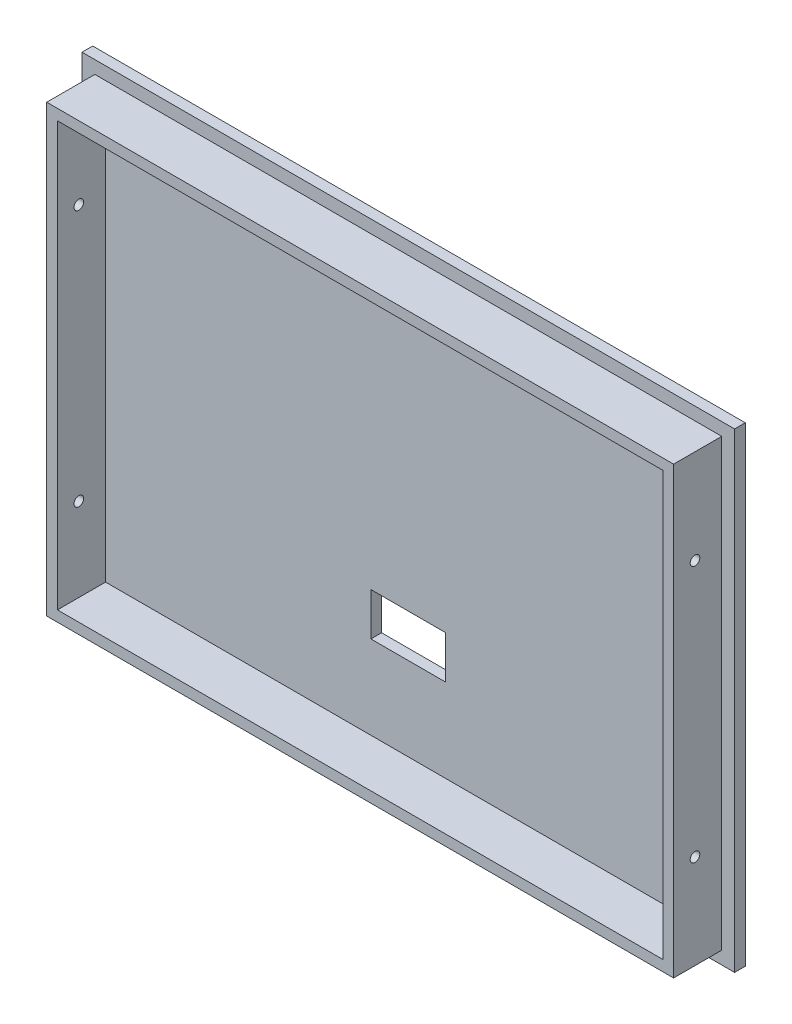
ISO-10303-21;
HEADER;
FILE_DESCRIPTION(('STEP AP214'),'2;1');
FILE_NAME('part.step','',(''),(''),'','','');
FILE_SCHEMA(('AUTOMOTIVE_DESIGN { 1 0 10303 214 1 1 1 1 }'));
ENDSEC;
DATA;
#1=APPLICATION_CONTEXT('core data for automotive mechanical design processes');
#2=APPLICATION_PROTOCOL_DEFINITION('international standard','automotive_design',2000,#1);
#3=PRODUCT_CONTEXT('',#1,'mechanical');
#4=PRODUCT('Part','Part','',(#3));
#5=PRODUCT_RELATED_PRODUCT_CATEGORY('part','',(#4));
#6=PRODUCT_DEFINITION_FORMATION('','',#4);
#7=PRODUCT_DEFINITION_CONTEXT('part definition',#1,'design');
#8=PRODUCT_DEFINITION('design','',#6,#7);
#9=PRODUCT_DEFINITION_SHAPE('','',#8);
#10=(LENGTH_UNIT() NAMED_UNIT(*) SI_UNIT(.MILLI.,.METRE.));
#11=(NAMED_UNIT(*) PLANE_ANGLE_UNIT() SI_UNIT($,.RADIAN.));
#12=(NAMED_UNIT(*) SI_UNIT($,.STERADIAN.) SOLID_ANGLE_UNIT());
#13=UNCERTAINTY_MEASURE_WITH_UNIT(LENGTH_MEASURE(1.E-05),#10,'distance_accuracy_value','');
#14=(GEOMETRIC_REPRESENTATION_CONTEXT(3) GLOBAL_UNCERTAINTY_ASSIGNED_CONTEXT((#13)) GLOBAL_UNIT_ASSIGNED_CONTEXT((#10,
#11,#12)) REPRESENTATION_CONTEXT('',''));
#15=CARTESIAN_POINT('',(0.,0.,0.));
#16=DIRECTION('',(0.,0.,1.));
#17=DIRECTION('',(1.,0.,0.));
#18=AXIS2_PLACEMENT_3D('',#15,#16,#17);
#19=CARTESIAN_POINT('',(0.,0.,-2.));
#20=DIRECTION('',(0.,0.,-1.));
#21=DIRECTION('',(-1.,0.,0.));
#22=AXIS2_PLACEMENT_3D('',#19,#20,#21);
#23=PLANE('',#22);
#24=DIRECTION('',(0.,-1.,0.));
#25=VECTOR('',#24,1.);
#26=CARTESIAN_POINT('',(-61.,0.,-2.));
#27=LINE('',#26,#25);
#28=CARTESIAN_POINT('',(-61.,88.,-2.));
#29=VERTEX_POINT('',#28);
#30=CARTESIAN_POINT('',(-61.,0.,-2.));
#31=VERTEX_POINT('',#30);
#32=EDGE_CURVE('E256',#29,#31,#27,.T.);
#33=ORIENTED_EDGE('',*,*,#32,.F.);
#34=DIRECTION('',(-1.,0.,0.));
#35=VECTOR('',#34,1.);
#36=CARTESIAN_POINT('',(-61.,88.,-2.));
#37=LINE('',#36,#35);
#38=CARTESIAN_POINT('',(61.,88.,-2.));
#39=VERTEX_POINT('',#38);
#40=EDGE_CURVE('E261',#39,#29,#37,.T.);
#41=ORIENTED_EDGE('',*,*,#40,.F.);
#42=DIRECTION('',(0.,1.,0.));
#43=VECTOR('',#42,1.);
#44=CARTESIAN_POINT('',(61.,0.,-2.));
#45=LINE('',#44,#43);
#46=CARTESIAN_POINT('',(61.,0.,-2.));
#47=VERTEX_POINT('',#46);
#48=EDGE_CURVE('E272',#47,#39,#45,.T.);
#49=ORIENTED_EDGE('',*,*,#48,.F.);
#50=DIRECTION('',(1.,0.,0.));
#51=VECTOR('',#50,1.);
#52=CARTESIAN_POINT('',(-61.,0.,-2.));
#53=LINE('',#52,#51);
#54=EDGE_CURVE('E270',#31,#47,#53,.T.);
#55=ORIENTED_EDGE('',*,*,#54,.F.);
#56=EDGE_LOOP('',(#33,#41,#49,#55));
#57=FACE_BOUND('',#56,.T.);
#58=DIRECTION('',(-1.,0.,0.));
#59=VECTOR('',#58,1.);
#60=CARTESIAN_POINT('',(0.,28.,-2.));
#61=LINE('',#60,#59);
#62=CARTESIAN_POINT('',(7.,28.,-2.));
#63=VERTEX_POINT('',#62);
#64=CARTESIAN_POINT('',(-7.,28.,-2.));
#65=VERTEX_POINT('',#64);
#66=EDGE_CURVE('E206',#63,#65,#61,.T.);
#67=ORIENTED_EDGE('',*,*,#66,.T.);
#68=DIRECTION('',(0.,-1.,0.));
#69=VECTOR('',#68,1.);
#70=CARTESIAN_POINT('',(-7.,0.,-2.));
#71=LINE('',#70,#69);
#72=CARTESIAN_POINT('',(-7.,20.,-2.));
#73=VERTEX_POINT('',#72);
#74=EDGE_CURVE('E167',#65,#73,#71,.T.);
#75=ORIENTED_EDGE('',*,*,#74,.T.);
#76=DIRECTION('',(1.,0.,0.));
#77=VECTOR('',#76,1.);
#78=CARTESIAN_POINT('',(0.,20.,-2.));
#79=LINE('',#78,#77);
#80=CARTESIAN_POINT('',(7.,20.,-2.));
#81=VERTEX_POINT('',#80);
#82=EDGE_CURVE('E211',#73,#81,#79,.T.);
#83=ORIENTED_EDGE('',*,*,#82,.T.);
#84=DIRECTION('',(0.,1.,0.));
#85=VECTOR('',#84,1.);
#86=CARTESIAN_POINT('',(7.,0.,-2.));
#87=LINE('',#86,#85);
#88=EDGE_CURVE('E208',#81,#63,#87,.T.);
#89=ORIENTED_EDGE('',*,*,#88,.T.);
#90=EDGE_LOOP('',(#67,#75,#83,#89));
#91=FACE_BOUND('',#90,.T.);
#92=ADVANCED_FACE('F43',(#57,#91),#23,.T.);
#93=CARTESIAN_POINT('',(0.,0.,0.));
#94=DIRECTION('',(0.,0.,-1.));
#95=DIRECTION('',(-1.,0.,0.));
#96=AXIS2_PLACEMENT_3D('',#93,#94,#95);
#97=PLANE('',#96);
#98=DIRECTION('',(0.,-1.,0.));
#99=VECTOR('',#98,1.);
#100=CARTESIAN_POINT('',(-56.6,4.4,0.));
#101=LINE('',#100,#99);
#102=CARTESIAN_POINT('',(-56.6,83.6,0.));
#103=VERTEX_POINT('',#102);
#104=CARTESIAN_POINT('',(-56.6,4.4,0.));
#105=VERTEX_POINT('',#104);
#106=EDGE_CURVE('E215',#103,#105,#101,.T.);
#107=ORIENTED_EDGE('',*,*,#106,.T.);
#108=DIRECTION('',(1.,0.,0.));
#109=VECTOR('',#108,1.);
#110=CARTESIAN_POINT('',(-56.6,4.4,0.));
#111=LINE('',#110,#109);
#112=CARTESIAN_POINT('',(56.6,4.4,0.));
#113=VERTEX_POINT('',#112);
#114=EDGE_CURVE('E218',#105,#113,#111,.T.);
#115=ORIENTED_EDGE('',*,*,#114,.T.);
#116=DIRECTION('',(0.,1.,0.));
#117=VECTOR('',#116,1.);
#118=CARTESIAN_POINT('',(56.6,4.4,0.));
#119=LINE('',#118,#117);
#120=CARTESIAN_POINT('',(56.6,83.6,0.));
#121=VERTEX_POINT('',#120);
#122=EDGE_CURVE('E221',#113,#121,#119,.T.);
#123=ORIENTED_EDGE('',*,*,#122,.T.);
#124=DIRECTION('',(-1.,0.,0.));
#125=VECTOR('',#124,1.);
#126=CARTESIAN_POINT('',(-56.6,83.6,0.));
#127=LINE('',#126,#125);
#128=EDGE_CURVE('E224',#121,#103,#127,.T.);
#129=ORIENTED_EDGE('',*,*,#128,.T.);
#130=EDGE_LOOP('',(#107,#115,#123,#129));
#131=FACE_BOUND('',#130,.T.);
#132=DIRECTION('',(0.,-1.,0.));
#133=VECTOR('',#132,1.);
#134=CARTESIAN_POINT('',(-7.,0.,0.));
#135=LINE('',#134,#133);
#136=CARTESIAN_POINT('',(-7.,28.,0.));
#137=VERTEX_POINT('',#136);
#138=CARTESIAN_POINT('',(-7.,20.,0.));
#139=VERTEX_POINT('',#138);
#140=EDGE_CURVE('E11',#137,#139,#135,.T.);
#141=ORIENTED_EDGE('',*,*,#140,.F.);
#142=DIRECTION('',(-1.,0.,0.));
#143=VECTOR('',#142,1.);
#144=CARTESIAN_POINT('',(0.,28.,0.));
#145=LINE('',#144,#143);
#146=CARTESIAN_POINT('',(7.,28.,0.));
#147=VERTEX_POINT('',#146);
#148=EDGE_CURVE('E154',#147,#137,#145,.T.);
#149=ORIENTED_EDGE('',*,*,#148,.F.);
#150=DIRECTION('',(0.,1.,0.));
#151=VECTOR('',#150,1.);
#152=CARTESIAN_POINT('',(7.,0.,0.));
#153=LINE('',#152,#151);
#154=CARTESIAN_POINT('',(7.,20.,0.));
#155=VERTEX_POINT('',#154);
#156=EDGE_CURVE('E159',#155,#147,#153,.T.);
#157=ORIENTED_EDGE('',*,*,#156,.F.);
#158=DIRECTION('',(1.,0.,0.));
#159=VECTOR('',#158,1.);
#160=CARTESIAN_POINT('',(0.,20.,0.));
#161=LINE('',#160,#159);
#162=EDGE_CURVE('E52',#139,#155,#161,.T.);
#163=ORIENTED_EDGE('',*,*,#162,.F.);
#164=EDGE_LOOP('',(#141,#149,#157,#163));
#165=FACE_BOUND('',#164,.T.);
#166=ADVANCED_FACE('F172',(#131,#165),#97,.F.);
#167=CARTESIAN_POINT('',(0.,0.,9.));
#168=DIRECTION('',(0.,0.,-1.));
#169=DIRECTION('',(-1.,0.,0.));
#170=AXIS2_PLACEMENT_3D('',#167,#168,#169);
#171=PLANE('',#170);
#172=DIRECTION('',(0.,-1.,0.));
#173=VECTOR('',#172,1.);
#174=CARTESIAN_POINT('',(-58.6,2.4,9.));
#175=LINE('',#174,#173);
#176=CARTESIAN_POINT('',(-58.6,85.6,9.));
#177=VERTEX_POINT('',#176);
#178=CARTESIAN_POINT('',(-58.6,2.4,9.));
#179=VERTEX_POINT('',#178);
#180=EDGE_CURVE('E235',#177,#179,#175,.T.);
#181=ORIENTED_EDGE('',*,*,#180,.T.);
#182=DIRECTION('',(1.,0.,0.));
#183=VECTOR('',#182,1.);
#184=CARTESIAN_POINT('',(-58.6,2.4,9.));
#185=LINE('',#184,#183);
#186=CARTESIAN_POINT('',(58.6,2.4,9.));
#187=VERTEX_POINT('',#186);
#188=EDGE_CURVE('E238',#179,#187,#185,.T.);
#189=ORIENTED_EDGE('',*,*,#188,.T.);
#190=DIRECTION('',(0.,1.,0.));
#191=VECTOR('',#190,1.);
#192=CARTESIAN_POINT('',(58.6,2.4,9.));
#193=LINE('',#192,#191);
#194=CARTESIAN_POINT('',(58.6,85.6,9.));
#195=VERTEX_POINT('',#194);
#196=EDGE_CURVE('E240',#187,#195,#193,.T.);
#197=ORIENTED_EDGE('',*,*,#196,.T.);
#198=DIRECTION('',(-1.,0.,0.));
#199=VECTOR('',#198,1.);
#200=CARTESIAN_POINT('',(-58.6,85.6,9.));
#201=LINE('',#200,#199);
#202=EDGE_CURVE('E242',#195,#177,#201,.T.);
#203=ORIENTED_EDGE('',*,*,#202,.T.);
#204=EDGE_LOOP('',(#181,#189,#197,#203));
#205=FACE_BOUND('',#204,.T.);
#206=DIRECTION('',(0.,-1.,0.));
#207=VECTOR('',#206,1.);
#208=CARTESIAN_POINT('',(-56.6,0.,9.));
#209=LINE('',#208,#207);
#210=CARTESIAN_POINT('',(-56.6,83.6,9.));
#211=VERTEX_POINT('',#210);
#212=CARTESIAN_POINT('',(-56.6,4.4,9.));
#213=VERTEX_POINT('',#212);
#214=EDGE_CURVE('E160',#211,#213,#209,.T.);
#215=ORIENTED_EDGE('',*,*,#214,.F.);
#216=DIRECTION('',(-1.,0.,0.));
#217=VECTOR('',#216,1.);
#218=CARTESIAN_POINT('',(0.,83.6,9.));
#219=LINE('',#218,#217);
#220=CARTESIAN_POINT('',(56.6,83.6,9.));
#221=VERTEX_POINT('',#220);
#222=EDGE_CURVE('E298',#221,#211,#219,.T.);
#223=ORIENTED_EDGE('',*,*,#222,.F.);
#224=DIRECTION('',(0.,1.,0.));
#225=VECTOR('',#224,1.);
#226=CARTESIAN_POINT('',(56.6,0.,9.));
#227=LINE('',#226,#225);
#228=CARTESIAN_POINT('',(56.6,4.4,9.));
#229=VERTEX_POINT('',#228);
#230=EDGE_CURVE('E300',#229,#221,#227,.T.);
#231=ORIENTED_EDGE('',*,*,#230,.F.);
#232=DIRECTION('',(1.,0.,0.));
#233=VECTOR('',#232,1.);
#234=CARTESIAN_POINT('',(0.,4.4,9.));
#235=LINE('',#234,#233);
#236=EDGE_CURVE('E303',#213,#229,#235,.T.);
#237=ORIENTED_EDGE('',*,*,#236,.F.);
#238=EDGE_LOOP('',(#215,#223,#231,#237));
#239=FACE_BOUND('',#238,.T.);
#240=ADVANCED_FACE('F319',(#205,#239),#171,.F.);
#241=CARTESIAN_POINT('',(0.,0.,0.));
#242=DIRECTION('',(0.,0.,-1.));
#243=DIRECTION('',(-1.,0.,0.));
#244=AXIS2_PLACEMENT_3D('',#241,#242,#243);
#245=PLANE('',#244);
#246=DIRECTION('',(0.,-1.,0.));
#247=VECTOR('',#246,1.);
#248=CARTESIAN_POINT('',(-61.,0.,0.));
#249=LINE('',#248,#247);
#250=CARTESIAN_POINT('',(-61.,88.,0.));
#251=VERTEX_POINT('',#250);
#252=CARTESIAN_POINT('',(-61.,0.,0.));
#253=VERTEX_POINT('',#252);
#254=EDGE_CURVE('E257',#251,#253,#249,.T.);
#255=ORIENTED_EDGE('',*,*,#254,.T.);
#256=DIRECTION('',(1.,0.,0.));
#257=VECTOR('',#256,1.);
#258=CARTESIAN_POINT('',(-61.,0.,0.));
#259=LINE('',#258,#257);
#260=CARTESIAN_POINT('',(61.,0.,0.));
#261=VERTEX_POINT('',#260);
#262=EDGE_CURVE('E260',#253,#261,#259,.T.);
#263=ORIENTED_EDGE('',*,*,#262,.T.);
#264=DIRECTION('',(0.,1.,0.));
#265=VECTOR('',#264,1.);
#266=CARTESIAN_POINT('',(61.,0.,0.));
#267=LINE('',#266,#265);
#268=CARTESIAN_POINT('',(61.,88.,0.));
#269=VERTEX_POINT('',#268);
#270=EDGE_CURVE('E263',#261,#269,#267,.T.);
#271=ORIENTED_EDGE('',*,*,#270,.T.);
#272=DIRECTION('',(-1.,0.,0.));
#273=VECTOR('',#272,1.);
#274=CARTESIAN_POINT('',(-61.,88.,0.));
#275=LINE('',#274,#273);
#276=EDGE_CURVE('E265',#269,#251,#275,.T.);
#277=ORIENTED_EDGE('',*,*,#276,.T.);
#278=EDGE_LOOP('',(#255,#263,#271,#277));
#279=FACE_BOUND('',#278,.T.);
#280=DIRECTION('',(0.,-1.,0.));
#281=VECTOR('',#280,1.);
#282=CARTESIAN_POINT('',(-58.6,0.,0.));
#283=LINE('',#282,#281);
#284=CARTESIAN_POINT('',(-58.6,85.6,0.));
#285=VERTEX_POINT('',#284);
#286=CARTESIAN_POINT('',(-58.6,2.4,0.));
#287=VERTEX_POINT('',#286);
#288=EDGE_CURVE('E295',#285,#287,#283,.T.);
#289=ORIENTED_EDGE('',*,*,#288,.F.);
#290=DIRECTION('',(-1.,0.,0.));
#291=VECTOR('',#290,1.);
#292=CARTESIAN_POINT('',(0.,85.6,0.));
#293=LINE('',#292,#291);
#294=CARTESIAN_POINT('',(58.6,85.6,0.));
#295=VERTEX_POINT('',#294);
#296=EDGE_CURVE('E286',#295,#285,#293,.T.);
#297=ORIENTED_EDGE('',*,*,#296,.F.);
#298=DIRECTION('',(0.,1.,0.));
#299=VECTOR('',#298,1.);
#300=CARTESIAN_POINT('',(58.6,0.,0.));
#301=LINE('',#300,#299);
#302=CARTESIAN_POINT('',(58.6,2.4,0.));
#303=VERTEX_POINT('',#302);
#304=EDGE_CURVE('E289',#303,#295,#301,.T.);
#305=ORIENTED_EDGE('',*,*,#304,.F.);
#306=DIRECTION('',(1.,0.,0.));
#307=VECTOR('',#306,1.);
#308=CARTESIAN_POINT('',(0.,2.4,0.));
#309=LINE('',#308,#307);
#310=EDGE_CURVE('E292',#287,#303,#309,.T.);
#311=ORIENTED_EDGE('',*,*,#310,.F.);
#312=EDGE_LOOP('',(#289,#297,#305,#311));
#313=FACE_BOUND('',#312,.T.);
#314=ADVANCED_FACE('F351',(#279,#313),#245,.F.);
#315=CARTESIAN_POINT('',(-61.,0.,0.));
#316=DIRECTION('',(1.,0.,0.));
#317=DIRECTION('',(0.,0.,-1.));
#318=AXIS2_PLACEMENT_3D('',#315,#316,#317);
#319=PLANE('',#318);
#320=ORIENTED_EDGE('',*,*,#32,.T.);
#321=DIRECTION('',(0.,0.,-1.));
#322=VECTOR('',#321,1.);
#323=CARTESIAN_POINT('',(-61.,0.,0.));
#324=LINE('',#323,#322);
#325=EDGE_CURVE('E283',#253,#31,#324,.T.);
#326=ORIENTED_EDGE('',*,*,#325,.F.);
#327=ORIENTED_EDGE('',*,*,#254,.F.);
#328=DIRECTION('',(0.,0.,-1.));
#329=VECTOR('',#328,1.);
#330=CARTESIAN_POINT('',(-61.,88.,0.));
#331=LINE('',#330,#329);
#332=EDGE_CURVE('E267',#251,#29,#331,.T.);
#333=ORIENTED_EDGE('',*,*,#332,.T.);
#334=EDGE_LOOP('',(#320,#326,#327,#333));
#335=FACE_BOUND('',#334,.T.);
#336=ADVANCED_FACE('F45',(#335),#319,.F.);
#337=CARTESIAN_POINT('',(-61.,0.,0.));
#338=DIRECTION('',(0.,1.,0.));
#339=DIRECTION('',(0.,0.,1.));
#340=AXIS2_PLACEMENT_3D('',#337,#338,#339);
#341=PLANE('',#340);
#342=ORIENTED_EDGE('',*,*,#54,.T.);
#343=DIRECTION('',(0.,0.,-1.));
#344=VECTOR('',#343,1.);
#345=CARTESIAN_POINT('',(61.,0.,0.));
#346=LINE('',#345,#344);
#347=EDGE_CURVE('E280',#261,#47,#346,.T.);
#348=ORIENTED_EDGE('',*,*,#347,.F.);
#349=ORIENTED_EDGE('',*,*,#262,.F.);
#350=ORIENTED_EDGE('',*,*,#325,.T.);
#351=EDGE_LOOP('',(#342,#348,#349,#350));
#352=FACE_BOUND('',#351,.T.);
#353=ADVANCED_FACE('F360',(#352),#341,.F.);
#354=CARTESIAN_POINT('',(61.,0.,0.));
#355=DIRECTION('',(-1.,0.,0.));
#356=DIRECTION('',(0.,0.,1.));
#357=AXIS2_PLACEMENT_3D('',#354,#355,#356);
#358=PLANE('',#357);
#359=ORIENTED_EDGE('',*,*,#48,.T.);
#360=DIRECTION('',(0.,0.,-1.));
#361=VECTOR('',#360,1.);
#362=CARTESIAN_POINT('',(61.,88.,0.));
#363=LINE('',#362,#361);
#364=EDGE_CURVE('E277',#269,#39,#363,.T.);
#365=ORIENTED_EDGE('',*,*,#364,.F.);
#366=ORIENTED_EDGE('',*,*,#270,.F.);
#367=ORIENTED_EDGE('',*,*,#347,.T.);
#368=EDGE_LOOP('',(#359,#365,#366,#367));
#369=FACE_BOUND('',#368,.T.);
#370=ADVANCED_FACE('F357',(#369),#358,.F.);
#371=CARTESIAN_POINT('',(-61.,88.,0.));
#372=DIRECTION('',(0.,-1.,0.));
#373=DIRECTION('',(0.,0.,-1.));
#374=AXIS2_PLACEMENT_3D('',#371,#372,#373);
#375=PLANE('',#374);
#376=ORIENTED_EDGE('',*,*,#40,.T.);
#377=ORIENTED_EDGE('',*,*,#332,.F.);
#378=ORIENTED_EDGE('',*,*,#276,.F.);
#379=ORIENTED_EDGE('',*,*,#364,.T.);
#380=EDGE_LOOP('',(#376,#377,#378,#379));
#381=FACE_BOUND('',#380,.T.);
#382=ADVANCED_FACE('F353',(#381),#375,.F.);
#383=CARTESIAN_POINT('',(-58.6,2.4,9.));
#384=DIRECTION('',(1.,0.,0.));
#385=DIRECTION('',(0.,0.,-1.));
#386=AXIS2_PLACEMENT_3D('',#383,#384,#385);
#387=PLANE('',#386);
#388=CARTESIAN_POINT('',(-58.6,68.,5.));
#389=DIRECTION('',(1.,0.,0.));
#390=DIRECTION('',(0.,0.,-1.));
#391=AXIS2_PLACEMENT_3D('',#388,#389,#390);
#392=CIRCLE('',#391,0.9);
#393=CARTESIAN_POINT('',(-58.6,68.,4.1));
#394=VERTEX_POINT('',#393);
#395=EDGE_CURVE('E181',#394,#394,#392,.F.);
#396=ORIENTED_EDGE('',*,*,#395,.F.);
#397=EDGE_LOOP('',(#396));
#398=FACE_BOUND('',#397,.T.);
#399=CARTESIAN_POINT('',(-58.6,20.,5.));
#400=DIRECTION('',(1.,0.,0.));
#401=DIRECTION('',(0.,0.,-1.));
#402=AXIS2_PLACEMENT_3D('',#399,#400,#401);
#403=CIRCLE('',#402,0.9);
#404=CARTESIAN_POINT('',(-58.6,20.,4.1));
#405=VERTEX_POINT('',#404);
#406=EDGE_CURVE('E169',#405,#405,#403,.F.);
#407=ORIENTED_EDGE('',*,*,#406,.F.);
#408=EDGE_LOOP('',(#407));
#409=FACE_BOUND('',#408,.T.);
#410=DIRECTION('',(0.,0.,-1.));
#411=VECTOR('',#410,1.);
#412=CARTESIAN_POINT('',(-58.6,85.6,9.));
#413=LINE('',#412,#411);
#414=EDGE_CURVE('E244',#177,#285,#413,.T.);
#415=ORIENTED_EDGE('',*,*,#414,.T.);
#416=ORIENTED_EDGE('',*,*,#288,.T.);
#417=DIRECTION('',(0.,0.,-1.));
#418=VECTOR('',#417,1.);
#419=CARTESIAN_POINT('',(-58.6,2.4,9.));
#420=LINE('',#419,#418);
#421=EDGE_CURVE('E253',#179,#287,#420,.T.);
#422=ORIENTED_EDGE('',*,*,#421,.F.);
#423=ORIENTED_EDGE('',*,*,#180,.F.);
#424=EDGE_LOOP('',(#415,#416,#422,#423));
#425=FACE_BOUND('',#424,.T.);
#426=ADVANCED_FACE('F356',(#398,#409,#425),#387,.F.);
#427=CARTESIAN_POINT('',(-58.6,2.4,9.));
#428=DIRECTION('',(0.,1.,0.));
#429=DIRECTION('',(0.,0.,1.));
#430=AXIS2_PLACEMENT_3D('',#427,#428,#429);
#431=PLANE('',#430);
#432=ORIENTED_EDGE('',*,*,#421,.T.);
#433=ORIENTED_EDGE('',*,*,#310,.T.);
#434=DIRECTION('',(0.,0.,-1.));
#435=VECTOR('',#434,1.);
#436=CARTESIAN_POINT('',(58.6,2.4,9.));
#437=LINE('',#436,#435);
#438=EDGE_CURVE('E250',#187,#303,#437,.T.);
#439=ORIENTED_EDGE('',*,*,#438,.F.);
#440=ORIENTED_EDGE('',*,*,#188,.F.);
#441=EDGE_LOOP('',(#432,#433,#439,#440));
#442=FACE_BOUND('',#441,.T.);
#443=ADVANCED_FACE('F394',(#442),#431,.F.);
#444=CARTESIAN_POINT('',(58.6,2.4,9.));
#445=DIRECTION('',(-1.,0.,0.));
#446=DIRECTION('',(0.,0.,1.));
#447=AXIS2_PLACEMENT_3D('',#444,#445,#446);
#448=PLANE('',#447);
#449=CARTESIAN_POINT('',(58.6,68.,5.));
#450=DIRECTION('',(-1.,0.,0.));
#451=DIRECTION('',(0.,0.,1.));
#452=AXIS2_PLACEMENT_3D('',#449,#450,#451);
#453=CIRCLE('',#452,0.9);
#454=CARTESIAN_POINT('',(58.6,68.,5.9));
#455=VERTEX_POINT('',#454);
#456=EDGE_CURVE('E188',#455,#455,#453,.F.);
#457=ORIENTED_EDGE('',*,*,#456,.F.);
#458=EDGE_LOOP('',(#457));
#459=FACE_BOUND('',#458,.T.);
#460=CARTESIAN_POINT('',(58.6,20.,5.));
#461=DIRECTION('',(-1.,0.,0.));
#462=DIRECTION('',(0.,0.,1.));
#463=AXIS2_PLACEMENT_3D('',#460,#461,#462);
#464=CIRCLE('',#463,0.9);
#465=CARTESIAN_POINT('',(58.6,20.,5.9));
#466=VERTEX_POINT('',#465);
#467=EDGE_CURVE('E185',#466,#466,#464,.F.);
#468=ORIENTED_EDGE('',*,*,#467,.F.);
#469=EDGE_LOOP('',(#468));
#470=FACE_BOUND('',#469,.T.);
#471=ORIENTED_EDGE('',*,*,#438,.T.);
#472=ORIENTED_EDGE('',*,*,#304,.T.);
#473=DIRECTION('',(0.,0.,-1.));
#474=VECTOR('',#473,1.);
#475=CARTESIAN_POINT('',(58.6,85.6,9.));
#476=LINE('',#475,#474);
#477=EDGE_CURVE('E247',#195,#295,#476,.T.);
#478=ORIENTED_EDGE('',*,*,#477,.F.);
#479=ORIENTED_EDGE('',*,*,#196,.F.);
#480=EDGE_LOOP('',(#471,#472,#478,#479));
#481=FACE_BOUND('',#480,.T.);
#482=ADVANCED_FACE('F392',(#459,#470,#481),#448,.F.);
#483=CARTESIAN_POINT('',(-58.6,85.6,9.));
#484=DIRECTION('',(0.,-1.,0.));
#485=DIRECTION('',(0.,0.,-1.));
#486=AXIS2_PLACEMENT_3D('',#483,#484,#485);
#487=PLANE('',#486);
#488=ORIENTED_EDGE('',*,*,#477,.T.);
#489=ORIENTED_EDGE('',*,*,#296,.T.);
#490=ORIENTED_EDGE('',*,*,#414,.F.);
#491=ORIENTED_EDGE('',*,*,#202,.F.);
#492=EDGE_LOOP('',(#488,#489,#490,#491));
#493=FACE_BOUND('',#492,.T.);
#494=ADVANCED_FACE('F384',(#493),#487,.F.);
#495=CARTESIAN_POINT('',(-56.6,4.4,10.));
#496=DIRECTION('',(1.,0.,0.));
#497=DIRECTION('',(0.,0.,-1.));
#498=AXIS2_PLACEMENT_3D('',#495,#496,#497);
#499=PLANE('',#498);
#500=CARTESIAN_POINT('',(-56.6,68.,5.));
#501=DIRECTION('',(1.,0.,0.));
#502=DIRECTION('',(0.,0.,-1.));
#503=AXIS2_PLACEMENT_3D('',#500,#501,#502);
#504=CIRCLE('',#503,0.9);
#505=CARTESIAN_POINT('',(-56.6,68.,4.1));
#506=VERTEX_POINT('',#505);
#507=EDGE_CURVE('E193',#506,#506,#504,.F.);
#508=ORIENTED_EDGE('',*,*,#507,.T.);
#509=EDGE_LOOP('',(#508));
#510=FACE_BOUND('',#509,.T.);
#511=CARTESIAN_POINT('',(-56.6,20.,5.));
#512=DIRECTION('',(1.,0.,0.));
#513=DIRECTION('',(0.,0.,-1.));
#514=AXIS2_PLACEMENT_3D('',#511,#512,#513);
#515=CIRCLE('',#514,0.9);
#516=CARTESIAN_POINT('',(-56.6,20.,4.1));
#517=VERTEX_POINT('',#516);
#518=EDGE_CURVE('E180',#517,#517,#515,.F.);
#519=ORIENTED_EDGE('',*,*,#518,.T.);
#520=EDGE_LOOP('',(#519));
#521=FACE_BOUND('',#520,.T.);
#522=ORIENTED_EDGE('',*,*,#214,.T.);
#523=DIRECTION('',(0.,0.,-1.));
#524=VECTOR('',#523,1.);
#525=CARTESIAN_POINT('',(-56.6,4.4,10.));
#526=LINE('',#525,#524);
#527=EDGE_CURVE('E233',#213,#105,#526,.T.);
#528=ORIENTED_EDGE('',*,*,#527,.T.);
#529=ORIENTED_EDGE('',*,*,#106,.F.);
#530=DIRECTION('',(0.,0.,-1.));
#531=VECTOR('',#530,1.);
#532=CARTESIAN_POINT('',(-56.6,83.6,10.));
#533=LINE('',#532,#531);
#534=EDGE_CURVE('E227',#211,#103,#533,.T.);
#535=ORIENTED_EDGE('',*,*,#534,.F.);
#536=EDGE_LOOP('',(#522,#528,#529,#535));
#537=FACE_BOUND('',#536,.T.);
#538=ADVANCED_FACE('F309',(#510,#521,#537),#499,.T.);
#539=CARTESIAN_POINT('',(-56.6,4.4,10.));
#540=DIRECTION('',(0.,1.,0.));
#541=DIRECTION('',(0.,0.,1.));
#542=AXIS2_PLACEMENT_3D('',#539,#540,#541);
#543=PLANE('',#542);
#544=ORIENTED_EDGE('',*,*,#236,.T.);
#545=DIRECTION('',(0.,0.,-1.));
#546=VECTOR('',#545,1.);
#547=CARTESIAN_POINT('',(56.6,4.4,10.));
#548=LINE('',#547,#546);
#549=EDGE_CURVE('E231',#229,#113,#548,.T.);
#550=ORIENTED_EDGE('',*,*,#549,.T.);
#551=ORIENTED_EDGE('',*,*,#114,.F.);
#552=ORIENTED_EDGE('',*,*,#527,.F.);
#553=EDGE_LOOP('',(#544,#550,#551,#552));
#554=FACE_BOUND('',#553,.T.);
#555=ADVANCED_FACE('F316',(#554),#543,.T.);
#556=CARTESIAN_POINT('',(56.6,4.4,10.));
#557=DIRECTION('',(-1.,0.,0.));
#558=DIRECTION('',(0.,0.,1.));
#559=AXIS2_PLACEMENT_3D('',#556,#557,#558);
#560=PLANE('',#559);
#561=CARTESIAN_POINT('',(56.6,68.,5.));
#562=DIRECTION('',(-1.,0.,0.));
#563=DIRECTION('',(0.,0.,1.));
#564=AXIS2_PLACEMENT_3D('',#561,#562,#563);
#565=CIRCLE('',#564,0.9);
#566=CARTESIAN_POINT('',(56.6,68.,5.9));
#567=VERTEX_POINT('',#566);
#568=EDGE_CURVE('E47',#567,#567,#565,.F.);
#569=ORIENTED_EDGE('',*,*,#568,.T.);
#570=EDGE_LOOP('',(#569));
#571=FACE_BOUND('',#570,.T.);
#572=CARTESIAN_POINT('',(56.6,20.,5.));
#573=DIRECTION('',(-1.,0.,0.));
#574=DIRECTION('',(0.,0.,1.));
#575=AXIS2_PLACEMENT_3D('',#572,#573,#574);
#576=CIRCLE('',#575,0.9);
#577=CARTESIAN_POINT('',(56.6,20.,5.9));
#578=VERTEX_POINT('',#577);
#579=EDGE_CURVE('E178',#578,#578,#576,.F.);
#580=ORIENTED_EDGE('',*,*,#579,.T.);
#581=EDGE_LOOP('',(#580));
#582=FACE_BOUND('',#581,.T.);
#583=ORIENTED_EDGE('',*,*,#230,.T.);
#584=DIRECTION('',(0.,0.,-1.));
#585=VECTOR('',#584,1.);
#586=CARTESIAN_POINT('',(56.6,83.6,10.));
#587=LINE('',#586,#585);
#588=EDGE_CURVE('E229',#221,#121,#587,.T.);
#589=ORIENTED_EDGE('',*,*,#588,.T.);
#590=ORIENTED_EDGE('',*,*,#122,.F.);
#591=ORIENTED_EDGE('',*,*,#549,.F.);
#592=EDGE_LOOP('',(#583,#589,#590,#591));
#593=FACE_BOUND('',#592,.T.);
#594=ADVANCED_FACE('F321',(#571,#582,#593),#560,.T.);
#595=CARTESIAN_POINT('',(-56.6,83.6,10.));
#596=DIRECTION('',(0.,-1.,0.));
#597=DIRECTION('',(0.,0.,-1.));
#598=AXIS2_PLACEMENT_3D('',#595,#596,#597);
#599=PLANE('',#598);
#600=ORIENTED_EDGE('',*,*,#222,.T.);
#601=ORIENTED_EDGE('',*,*,#534,.T.);
#602=ORIENTED_EDGE('',*,*,#128,.F.);
#603=ORIENTED_EDGE('',*,*,#588,.F.);
#604=EDGE_LOOP('',(#600,#601,#602,#603));
#605=FACE_BOUND('',#604,.T.);
#606=ADVANCED_FACE('F326',(#605),#599,.T.);
#607=CARTESIAN_POINT('',(-7.,20.,1.));
#608=DIRECTION('',(1.,0.,0.));
#609=DIRECTION('',(0.,0.,-1.));
#610=AXIS2_PLACEMENT_3D('',#607,#608,#609);
#611=PLANE('',#610);
#612=DIRECTION('',(0.,0.,-1.));
#613=VECTOR('',#612,1.);
#614=CARTESIAN_POINT('',(-7.,28.,1.));
#615=LINE('',#614,#613);
#616=EDGE_CURVE('E60',#137,#65,#615,.T.);
#617=ORIENTED_EDGE('',*,*,#616,.F.);
#618=ORIENTED_EDGE('',*,*,#140,.T.);
#619=DIRECTION('',(0.,0.,-1.));
#620=VECTOR('',#619,1.);
#621=CARTESIAN_POINT('',(-7.,20.,1.));
#622=LINE('',#621,#620);
#623=EDGE_CURVE('E204',#139,#73,#622,.T.);
#624=ORIENTED_EDGE('',*,*,#623,.T.);
#625=ORIENTED_EDGE('',*,*,#74,.F.);
#626=EDGE_LOOP('',(#617,#618,#624,#625));
#627=FACE_BOUND('',#626,.T.);
#628=ADVANCED_FACE('F163',(#627),#611,.T.);
#629=CARTESIAN_POINT('',(-7.,20.,1.));
#630=DIRECTION('',(0.,1.,0.));
#631=DIRECTION('',(0.,0.,1.));
#632=AXIS2_PLACEMENT_3D('',#629,#630,#631);
#633=PLANE('',#632);
#634=ORIENTED_EDGE('',*,*,#623,.F.);
#635=ORIENTED_EDGE('',*,*,#162,.T.);
#636=DIRECTION('',(0.,0.,-1.));
#637=VECTOR('',#636,1.);
#638=CARTESIAN_POINT('',(7.,20.,1.));
#639=LINE('',#638,#637);
#640=EDGE_CURVE('E202',#155,#81,#639,.T.);
#641=ORIENTED_EDGE('',*,*,#640,.T.);
#642=ORIENTED_EDGE('',*,*,#82,.F.);
#643=EDGE_LOOP('',(#634,#635,#641,#642));
#644=FACE_BOUND('',#643,.T.);
#645=ADVANCED_FACE('F334',(#644),#633,.T.);
#646=CARTESIAN_POINT('',(7.,20.,1.));
#647=DIRECTION('',(-1.,0.,0.));
#648=DIRECTION('',(0.,0.,1.));
#649=AXIS2_PLACEMENT_3D('',#646,#647,#648);
#650=PLANE('',#649);
#651=ORIENTED_EDGE('',*,*,#640,.F.);
#652=ORIENTED_EDGE('',*,*,#156,.T.);
#653=DIRECTION('',(0.,0.,-1.));
#654=VECTOR('',#653,1.);
#655=CARTESIAN_POINT('',(7.,28.,1.));
#656=LINE('',#655,#654);
#657=EDGE_CURVE('E65',#147,#63,#656,.T.);
#658=ORIENTED_EDGE('',*,*,#657,.T.);
#659=ORIENTED_EDGE('',*,*,#88,.F.);
#660=EDGE_LOOP('',(#651,#652,#658,#659));
#661=FACE_BOUND('',#660,.T.);
#662=ADVANCED_FACE('F488',(#661),#650,.T.);
#663=CARTESIAN_POINT('',(-7.,28.,1.));
#664=DIRECTION('',(0.,-1.,0.));
#665=DIRECTION('',(0.,0.,-1.));
#666=AXIS2_PLACEMENT_3D('',#663,#664,#665);
#667=PLANE('',#666);
#668=ORIENTED_EDGE('',*,*,#657,.F.);
#669=ORIENTED_EDGE('',*,*,#148,.T.);
#670=ORIENTED_EDGE('',*,*,#616,.T.);
#671=ORIENTED_EDGE('',*,*,#66,.F.);
#672=EDGE_LOOP('',(#668,#669,#670,#671));
#673=FACE_BOUND('',#672,.T.);
#674=ADVANCED_FACE('F155',(#673),#667,.T.);
#675=CARTESIAN_POINT('',(65.,20.,5.));
#676=DIRECTION('',(-1.,0.,0.));
#677=DIRECTION('',(0.,0.,1.));
#678=AXIS2_PLACEMENT_3D('',#675,#676,#677);
#679=CYLINDRICAL_SURFACE('',#678,0.9);
#680=ORIENTED_EDGE('',*,*,#579,.F.);
#681=EDGE_LOOP('',(#680));
#682=FACE_BOUND('',#681,.T.);
#683=ORIENTED_EDGE('',*,*,#467,.T.);
#684=EDGE_LOOP('',(#683));
#685=FACE_BOUND('',#684,.T.);
#686=ADVANCED_FACE('F487',(#682,#685),#679,.F.);
#687=ORIENTED_EDGE('',*,*,#518,.F.);
#688=EDGE_LOOP('',(#687));
#689=FACE_BOUND('',#688,.T.);
#690=ORIENTED_EDGE('',*,*,#406,.T.);
#691=EDGE_LOOP('',(#690));
#692=FACE_BOUND('',#691,.T.);
#693=ADVANCED_FACE('F494',(#689,#692),#679,.F.);
#694=CARTESIAN_POINT('',(65.,68.,5.));
#695=DIRECTION('',(-1.,0.,0.));
#696=DIRECTION('',(0.,0.,1.));
#697=AXIS2_PLACEMENT_3D('',#694,#695,#696);
#698=CYLINDRICAL_SURFACE('',#697,0.9);
#699=ORIENTED_EDGE('',*,*,#568,.F.);
#700=EDGE_LOOP('',(#699));
#701=FACE_BOUND('',#700,.T.);
#702=ORIENTED_EDGE('',*,*,#456,.T.);
#703=EDGE_LOOP('',(#702));
#704=FACE_BOUND('',#703,.T.);
#705=ADVANCED_FACE('F497',(#701,#704),#698,.F.);
#706=ORIENTED_EDGE('',*,*,#507,.F.);
#707=EDGE_LOOP('',(#706));
#708=FACE_BOUND('',#707,.T.);
#709=ORIENTED_EDGE('',*,*,#395,.T.);
#710=EDGE_LOOP('',(#709));
#711=FACE_BOUND('',#710,.T.);
#712=ADVANCED_FACE('F525',(#708,#711),#698,.F.);
#713=CLOSED_SHELL('',(#92,#166,#240,#314,#336,#353,#370,#382,#426,#443,#482,#494,#538,#555,#594,
#606,#628,#645,#662,#674,#686,#693,#705,#712));
#714=MANIFOLD_SOLID_BREP('B2',#713);
#715=ADVANCED_BREP_SHAPE_REPRESENTATION('',(#18,#714),#14);
#716=SHAPE_DEFINITION_REPRESENTATION(#9,#715);
ENDSEC;
END-ISO-10303-21;
